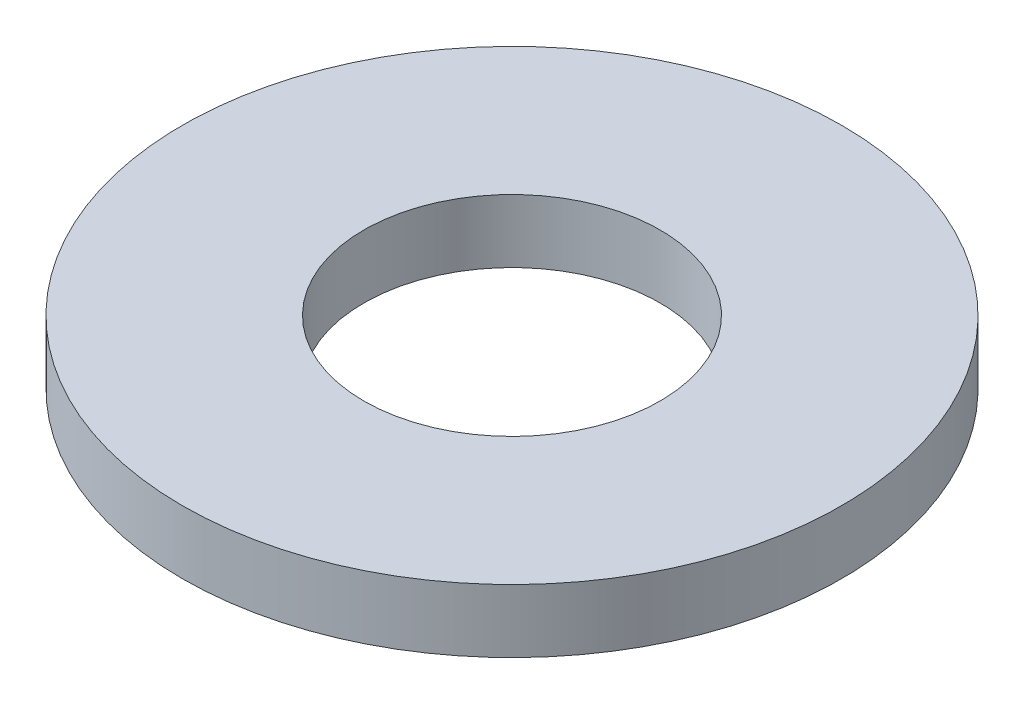
ISO-10303-21;
HEADER;
FILE_DESCRIPTION(('STEP AP214'),'2;1');
FILE_NAME('part.step','',(''),(''),'','','');
FILE_SCHEMA(('AUTOMOTIVE_DESIGN { 1 0 10303 214 1 1 1 1 }'));
ENDSEC;
DATA;
#1=APPLICATION_CONTEXT('core data for automotive mechanical design processes');
#2=APPLICATION_PROTOCOL_DEFINITION('international standard','automotive_design',2000,#1);
#3=PRODUCT_CONTEXT('',#1,'mechanical');
#4=PRODUCT('Part','Part','',(#3));
#5=PRODUCT_RELATED_PRODUCT_CATEGORY('part','',(#4));
#6=PRODUCT_DEFINITION_FORMATION('','',#4);
#7=PRODUCT_DEFINITION_CONTEXT('part definition',#1,'design');
#8=PRODUCT_DEFINITION('design','',#6,#7);
#9=PRODUCT_DEFINITION_SHAPE('','',#8);
#10=(LENGTH_UNIT() NAMED_UNIT(*) SI_UNIT(.MILLI.,.METRE.));
#11=(NAMED_UNIT(*) PLANE_ANGLE_UNIT() SI_UNIT($,.RADIAN.));
#12=(NAMED_UNIT(*) SI_UNIT($,.STERADIAN.) SOLID_ANGLE_UNIT());
#13=UNCERTAINTY_MEASURE_WITH_UNIT(LENGTH_MEASURE(1.E-05),#10,'distance_accuracy_value','');
#14=(GEOMETRIC_REPRESENTATION_CONTEXT(3) GLOBAL_UNCERTAINTY_ASSIGNED_CONTEXT((#13)) GLOBAL_UNIT_ASSIGNED_CONTEXT((#10,
#11,#12)) REPRESENTATION_CONTEXT('',''));
#15=CARTESIAN_POINT('',(0.,0.,0.));
#16=DIRECTION('',(0.,0.,1.));
#17=DIRECTION('',(1.,0.,0.));
#18=AXIS2_PLACEMENT_3D('',#15,#16,#17);
#19=CARTESIAN_POINT('',(0.,1.524,0.));
#20=DIRECTION('',(0.,-1.,0.));
#21=DIRECTION('',(0.,0.,-1.));
#22=AXIS2_PLACEMENT_3D('',#19,#20,#21);
#23=CYLINDRICAL_SURFACE('',#22,7.9375);
#24=CARTESIAN_POINT('',(0.,1.524,0.));
#25=DIRECTION('',(0.,1.,0.));
#26=DIRECTION('',(0.,0.,1.));
#27=AXIS2_PLACEMENT_3D('',#24,#25,#26);
#28=CIRCLE('',#27,7.9375);
#29=CARTESIAN_POINT('',(0.,1.524,-7.9375));
#30=VERTEX_POINT('',#29);
#31=EDGE_CURVE('E10',#30,#30,#28,.T.);
#32=CARTESIAN_POINT('',(0.,0.,0.));
#33=DIRECTION('',(0.,1.,0.));
#34=DIRECTION('',(0.,0.,1.));
#35=AXIS2_PLACEMENT_3D('',#32,#33,#34);
#36=CIRCLE('',#35,7.9375);
#37=CARTESIAN_POINT('',(0.,0.,-7.9375));
#38=VERTEX_POINT('',#37);
#39=EDGE_CURVE('E40',#38,#38,#36,.T.);
#40=CARTESIAN_POINT('',(0.,1.524,-7.9375));
#41=CARTESIAN_POINT('',(0.,1.508125,-7.9375));
#42=CARTESIAN_POINT('',(0.,1.49225,-7.9375));
#43=CARTESIAN_POINT('',(0.,1.4605,-7.9375));
#44=CARTESIAN_POINT('',(0.,1.444625,-7.9375));
#45=CARTESIAN_POINT('',(0.,1.412875,-7.9375));
#46=CARTESIAN_POINT('',(0.,1.397,-7.9375));
#47=CARTESIAN_POINT('',(0.,1.36525,-7.9375));
#48=CARTESIAN_POINT('',(0.,1.349375,-7.9375));
#49=CARTESIAN_POINT('',(0.,1.317625,-7.9375));
#50=CARTESIAN_POINT('',(0.,1.30175,-7.9375));
#51=CARTESIAN_POINT('',(0.,1.27,-7.9375));
#52=CARTESIAN_POINT('',(0.,1.254125,-7.9375));
#53=CARTESIAN_POINT('',(0.,1.222375,-7.9375));
#54=CARTESIAN_POINT('',(0.,1.2065,-7.9375));
#55=CARTESIAN_POINT('',(0.,1.17475,-7.9375));
#56=CARTESIAN_POINT('',(0.,1.158875,-7.9375));
#57=CARTESIAN_POINT('',(0.,1.127125,-7.9375));
#58=CARTESIAN_POINT('',(0.,1.11125,-7.9375));
#59=CARTESIAN_POINT('',(0.,1.0795,-7.9375));
#60=CARTESIAN_POINT('',(0.,1.063625,-7.9375));
#61=CARTESIAN_POINT('',(0.,1.031875,-7.9375));
#62=CARTESIAN_POINT('',(0.,1.016,-7.9375));
#63=CARTESIAN_POINT('',(0.,0.98425,-7.9375));
#64=CARTESIAN_POINT('',(0.,0.968375,-7.9375));
#65=CARTESIAN_POINT('',(0.,0.936625,-7.9375));
#66=CARTESIAN_POINT('',(0.,0.92075,-7.9375));
#67=CARTESIAN_POINT('',(0.,0.889,-7.9375));
#68=CARTESIAN_POINT('',(0.,0.873125,-7.9375));
#69=CARTESIAN_POINT('',(0.,0.841375,-7.9375));
#70=CARTESIAN_POINT('',(0.,0.8255,-7.9375));
#71=CARTESIAN_POINT('',(0.,0.79375,-7.9375));
#72=CARTESIAN_POINT('',(0.,0.777875,-7.9375));
#73=CARTESIAN_POINT('',(0.,0.746125,-7.9375));
#74=CARTESIAN_POINT('',(0.,0.73025,-7.9375));
#75=CARTESIAN_POINT('',(0.,0.6985,-7.9375));
#76=CARTESIAN_POINT('',(0.,0.682625,-7.9375));
#77=CARTESIAN_POINT('',(0.,0.650875,-7.9375));
#78=CARTESIAN_POINT('',(0.,0.635,-7.9375));
#79=CARTESIAN_POINT('',(0.,0.60325,-7.9375));
#80=CARTESIAN_POINT('',(0.,0.587375,-7.9375));
#81=CARTESIAN_POINT('',(0.,0.555625,-7.9375));
#82=CARTESIAN_POINT('',(0.,0.53975,-7.9375));
#83=CARTESIAN_POINT('',(0.,0.508,-7.9375));
#84=CARTESIAN_POINT('',(0.,0.492125,-7.9375));
#85=CARTESIAN_POINT('',(0.,0.460375,-7.9375));
#86=CARTESIAN_POINT('',(0.,0.4445,-7.9375));
#87=CARTESIAN_POINT('',(0.,0.41275,-7.9375));
#88=CARTESIAN_POINT('',(0.,0.396875,-7.9375));
#89=CARTESIAN_POINT('',(0.,0.365125,-7.9375));
#90=CARTESIAN_POINT('',(0.,0.34925,-7.9375));
#91=CARTESIAN_POINT('',(0.,0.3175,-7.9375));
#92=CARTESIAN_POINT('',(0.,0.301625,-7.9375));
#93=CARTESIAN_POINT('',(0.,0.269875,-7.9375));
#94=CARTESIAN_POINT('',(0.,0.254,-7.9375));
#95=CARTESIAN_POINT('',(0.,0.22225,-7.9375));
#96=CARTESIAN_POINT('',(0.,0.206375,-7.9375));
#97=CARTESIAN_POINT('',(0.,0.174625,-7.9375));
#98=CARTESIAN_POINT('',(0.,0.15875,-7.9375));
#99=CARTESIAN_POINT('',(0.,0.127,-7.9375));
#100=CARTESIAN_POINT('',(0.,0.111125,-7.9375));
#101=CARTESIAN_POINT('',(0.,0.079375,-7.9375));
#102=CARTESIAN_POINT('',(0.,0.0635,-7.9375));
#103=CARTESIAN_POINT('',(0.,0.0317499999999999,-7.9375));
#104=CARTESIAN_POINT('',(0.,0.015875,-7.9375));
#105=CARTESIAN_POINT('',(0.,0.,-7.9375));
#106=B_SPLINE_CURVE_WITH_KNOTS('',3,(#40,#41,#42,#43,#44,#45,#46,#47,#48,#49,#50,#51,#52,#53,
#54,#55,#56,#57,#58,#59,#60,#61,#62,#63,#64,#65,#66,#67,#68,#69,#70,#71,#72,#73,#74,#75,#76,#77,
#78,#79,#80,#81,#82,#83,#84,#85,#86,#87,#88,#89,#90,#91,#92,#93,#94,#95,#96,#97,#98,#99,#100,
#101,#102,#103,#104,#105),.UNSPECIFIED.,.F.,.F.,(4,2,2,2,2,2,2,2,2,2,2,2,2,2,2,2,2,2,2,2,2,2,2,
2,2,2,2,2,2,2,2,2,4),(0.,0.0476250000000001,0.0952500000000001,0.142875,0.1905,0.238125,0.28575,
0.333375,0.381,0.428625,0.47625,0.523875,0.5715,0.619125,0.66675,0.714375,0.762,0.809625,
0.85725,0.904875,0.9525,1.000125,1.04775,1.095375,1.143,1.190625,1.23825,1.285875,1.3335,
1.381125,1.42875,1.476375,1.524),.UNSPECIFIED.);
#107=EDGE_CURVE('BSEAM37',#30,#38,#106,.T.);
#108=ORIENTED_EDGE('',*,*,#31,.F.);
#109=ORIENTED_EDGE('',*,*,#39,.T.);
#110=ORIENTED_EDGE('',*,*,#107,.T.);
#111=ORIENTED_EDGE('',*,*,#107,.F.);
#112=EDGE_LOOP('',(#108,#110,#109,#111));
#113=FACE_BOUND('',#112,.T.);
#114=ADVANCED_FACE('F37',(#113),#23,.T.);
#115=CARTESIAN_POINT('',(0.,1.524,0.));
#116=DIRECTION('',(0.,1.,0.));
#117=DIRECTION('',(0.,0.,1.));
#118=AXIS2_PLACEMENT_3D('',#115,#116,#117);
#119=PLANE('',#118);
#120=CARTESIAN_POINT('',(0.,1.524,0.));
#121=DIRECTION('',(0.,1.,0.));
#122=DIRECTION('',(0.,0.,1.));
#123=AXIS2_PLACEMENT_3D('',#120,#121,#122);
#124=CIRCLE('',#123,3.5687);
#125=CARTESIAN_POINT('',(0.,1.524,3.5687));
#126=VERTEX_POINT('',#125);
#127=EDGE_CURVE('E49',#126,#126,#124,.T.);
#128=ORIENTED_EDGE('',*,*,#127,.F.);
#129=EDGE_LOOP('',(#128));
#130=FACE_BOUND('',#129,.T.);
#131=ORIENTED_EDGE('',*,*,#31,.T.);
#132=EDGE_LOOP('',(#131));
#133=FACE_BOUND('',#132,.T.);
#134=ADVANCED_FACE('F64',(#130,#133),#119,.T.);
#135=CARTESIAN_POINT('',(0.,0.,0.));
#136=DIRECTION('',(0.,1.,0.));
#137=DIRECTION('',(0.,0.,1.));
#138=AXIS2_PLACEMENT_3D('',#135,#136,#137);
#139=PLANE('',#138);
#140=CARTESIAN_POINT('',(0.,0.,0.));
#141=DIRECTION('',(0.,1.,0.));
#142=DIRECTION('',(0.,0.,1.));
#143=AXIS2_PLACEMENT_3D('',#140,#141,#142);
#144=CIRCLE('',#143,3.5687);
#145=CARTESIAN_POINT('',(0.,0.,3.5687));
#146=VERTEX_POINT('',#145);
#147=EDGE_CURVE('E47',#146,#146,#144,.T.);
#148=ORIENTED_EDGE('',*,*,#147,.T.);
#149=EDGE_LOOP('',(#148));
#150=FACE_BOUND('',#149,.T.);
#151=ORIENTED_EDGE('',*,*,#39,.F.);
#152=EDGE_LOOP('',(#151));
#153=FACE_BOUND('',#152,.T.);
#154=ADVANCED_FACE('F55',(#150,#153),#139,.F.);
#155=CARTESIAN_POINT('',(0.,0.,0.));
#156=DIRECTION('',(0.,1.,0.));
#157=DIRECTION('',(0.,0.,1.));
#158=AXIS2_PLACEMENT_3D('',#155,#156,#157);
#159=CYLINDRICAL_SURFACE('',#158,3.5687);
#160=CARTESIAN_POINT('',(0.,0.,3.5687));
#161=CARTESIAN_POINT('',(0.,0.015875,3.5687));
#162=CARTESIAN_POINT('',(0.,0.03175,3.5687));
#163=CARTESIAN_POINT('',(0.,0.0635,3.5687));
#164=CARTESIAN_POINT('',(0.,0.079375,3.5687));
#165=CARTESIAN_POINT('',(0.,0.111125,3.5687));
#166=CARTESIAN_POINT('',(0.,0.127,3.5687));
#167=CARTESIAN_POINT('',(0.,0.15875,3.5687));
#168=CARTESIAN_POINT('',(0.,0.174625,3.5687));
#169=CARTESIAN_POINT('',(0.,0.206375,3.5687));
#170=CARTESIAN_POINT('',(0.,0.22225,3.5687));
#171=CARTESIAN_POINT('',(0.,0.254,3.5687));
#172=CARTESIAN_POINT('',(0.,0.269875,3.5687));
#173=CARTESIAN_POINT('',(0.,0.301625,3.5687));
#174=CARTESIAN_POINT('',(0.,0.3175,3.5687));
#175=CARTESIAN_POINT('',(0.,0.34925,3.5687));
#176=CARTESIAN_POINT('',(0.,0.365125,3.5687));
#177=CARTESIAN_POINT('',(0.,0.396875,3.5687));
#178=CARTESIAN_POINT('',(0.,0.41275,3.5687));
#179=CARTESIAN_POINT('',(0.,0.4445,3.5687));
#180=CARTESIAN_POINT('',(0.,0.460375,3.5687));
#181=CARTESIAN_POINT('',(0.,0.492125,3.5687));
#182=CARTESIAN_POINT('',(0.,0.508,3.5687));
#183=CARTESIAN_POINT('',(0.,0.53975,3.5687));
#184=CARTESIAN_POINT('',(0.,0.555625,3.5687));
#185=CARTESIAN_POINT('',(0.,0.587375,3.5687));
#186=CARTESIAN_POINT('',(0.,0.60325,3.5687));
#187=CARTESIAN_POINT('',(0.,0.635,3.5687));
#188=CARTESIAN_POINT('',(0.,0.650875,3.5687));
#189=CARTESIAN_POINT('',(0.,0.682625,3.5687));
#190=CARTESIAN_POINT('',(0.,0.6985,3.5687));
#191=CARTESIAN_POINT('',(0.,0.73025,3.5687));
#192=CARTESIAN_POINT('',(0.,0.746125,3.5687));
#193=CARTESIAN_POINT('',(0.,0.777875,3.5687));
#194=CARTESIAN_POINT('',(0.,0.79375,3.5687));
#195=CARTESIAN_POINT('',(0.,0.8255,3.5687));
#196=CARTESIAN_POINT('',(0.,0.841375,3.5687));
#197=CARTESIAN_POINT('',(0.,0.873125,3.5687));
#198=CARTESIAN_POINT('',(0.,0.889,3.5687));
#199=CARTESIAN_POINT('',(0.,0.92075,3.5687));
#200=CARTESIAN_POINT('',(0.,0.936625,3.5687));
#201=CARTESIAN_POINT('',(0.,0.968375,3.5687));
#202=CARTESIAN_POINT('',(0.,0.98425,3.5687));
#203=CARTESIAN_POINT('',(0.,1.016,3.5687));
#204=CARTESIAN_POINT('',(0.,1.031875,3.5687));
#205=CARTESIAN_POINT('',(0.,1.063625,3.5687));
#206=CARTESIAN_POINT('',(0.,1.0795,3.5687));
#207=CARTESIAN_POINT('',(0.,1.11125,3.5687));
#208=CARTESIAN_POINT('',(0.,1.127125,3.5687));
#209=CARTESIAN_POINT('',(0.,1.158875,3.5687));
#210=CARTESIAN_POINT('',(0.,1.17475,3.5687));
#211=CARTESIAN_POINT('',(0.,1.2065,3.5687));
#212=CARTESIAN_POINT('',(0.,1.222375,3.5687));
#213=CARTESIAN_POINT('',(0.,1.254125,3.5687));
#214=CARTESIAN_POINT('',(0.,1.27,3.5687));
#215=CARTESIAN_POINT('',(0.,1.30175,3.5687));
#216=CARTESIAN_POINT('',(0.,1.317625,3.5687));
#217=CARTESIAN_POINT('',(0.,1.349375,3.5687));
#218=CARTESIAN_POINT('',(0.,1.36525,3.5687));
#219=CARTESIAN_POINT('',(0.,1.397,3.5687));
#220=CARTESIAN_POINT('',(0.,1.412875,3.5687));
#221=CARTESIAN_POINT('',(0.,1.444625,3.5687));
#222=CARTESIAN_POINT('',(0.,1.4605,3.5687));
#223=CARTESIAN_POINT('',(0.,1.49225,3.5687));
#224=CARTESIAN_POINT('',(0.,1.508125,3.5687));
#225=CARTESIAN_POINT('',(0.,1.524,3.5687));
#226=B_SPLINE_CURVE_WITH_KNOTS('',3,(#160,#161,#162,#163,#164,#165,#166,#167,#168,#169,#170,
#171,#172,#173,#174,#175,#176,#177,#178,#179,#180,#181,#182,#183,#184,#185,#186,#187,#188,#189,
#190,#191,#192,#193,#194,#195,#196,#197,#198,#199,#200,#201,#202,#203,#204,#205,#206,#207,#208,
#209,#210,#211,#212,#213,#214,#215,#216,#217,#218,#219,#220,#221,#222,#223,#224,#225),
.UNSPECIFIED.,.F.,.F.,(4,2,2,2,2,2,2,2,2,2,2,2,2,2,2,2,2,2,2,2,2,2,2,2,2,2,2,2,2,2,2,2,4),(0.,
0.047625,0.09525,0.142875,0.1905,0.238125,0.28575,0.333375,0.381,0.428625,0.47625,0.523875,
0.5715,0.619125,0.66675,0.714375,0.762,0.809625,0.85725,0.904875,0.9525,1.000125,1.04775,
1.095375,1.143,1.190625,1.23825,1.285875,1.3335,1.381125,1.42875,1.476375,1.524),.UNSPECIFIED.);
#227=EDGE_CURVE('BSEAM58',#146,#126,#226,.T.);
#228=ORIENTED_EDGE('',*,*,#147,.F.);
#229=ORIENTED_EDGE('',*,*,#127,.T.);
#230=ORIENTED_EDGE('',*,*,#227,.T.);
#231=ORIENTED_EDGE('',*,*,#227,.F.);
#232=EDGE_LOOP('',(#228,#230,#229,#231));
#233=FACE_BOUND('',#232,.T.);
#234=ADVANCED_FACE('F58',(#233),#159,.F.);
#235=CLOSED_SHELL('',(#114,#134,#154,#234));
#236=MANIFOLD_SOLID_BREP('B2',#235);
#237=ADVANCED_BREP_SHAPE_REPRESENTATION('',(#18,#236),#14);
#238=SHAPE_DEFINITION_REPRESENTATION(#9,#237);
ENDSEC;
END-ISO-10303-21;
